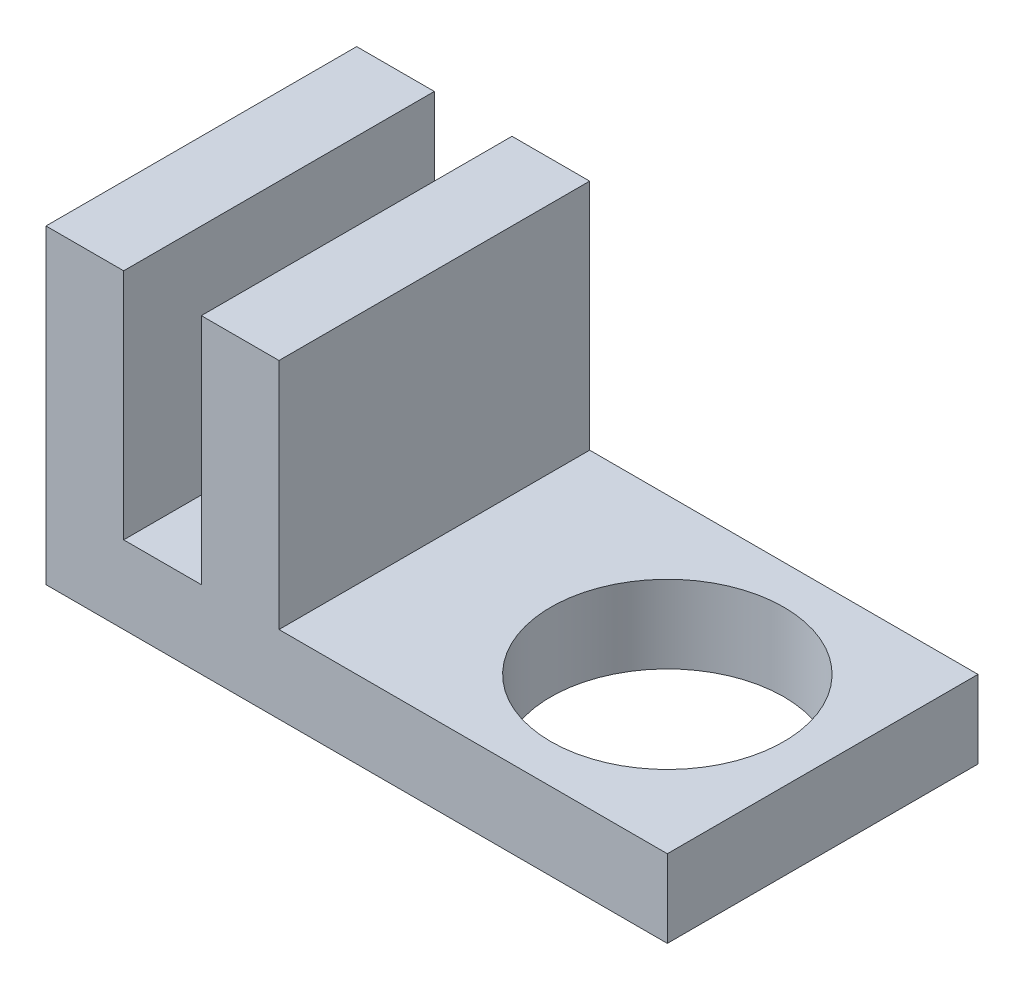
ISO-10303-21;
HEADER;
FILE_DESCRIPTION(('STEP AP214'),'2;1');
FILE_NAME('part.step','',(''),(''),'','','');
FILE_SCHEMA(('AUTOMOTIVE_DESIGN { 1 0 10303 214 1 1 1 1 }'));
ENDSEC;
DATA;
#1=APPLICATION_CONTEXT('core data for automotive mechanical design processes');
#2=APPLICATION_PROTOCOL_DEFINITION('international standard','automotive_design',2000,#1);
#3=PRODUCT_CONTEXT('',#1,'mechanical');
#4=PRODUCT('Part','Part','',(#3));
#5=PRODUCT_RELATED_PRODUCT_CATEGORY('part','',(#4));
#6=PRODUCT_DEFINITION_FORMATION('','',#4);
#7=PRODUCT_DEFINITION_CONTEXT('part definition',#1,'design');
#8=PRODUCT_DEFINITION('design','',#6,#7);
#9=PRODUCT_DEFINITION_SHAPE('','',#8);
#10=(LENGTH_UNIT() NAMED_UNIT(*) SI_UNIT(.MILLI.,.METRE.));
#11=(NAMED_UNIT(*) PLANE_ANGLE_UNIT() SI_UNIT($,.RADIAN.));
#12=(NAMED_UNIT(*) SI_UNIT($,.STERADIAN.) SOLID_ANGLE_UNIT());
#13=UNCERTAINTY_MEASURE_WITH_UNIT(LENGTH_MEASURE(1.E-05),#10,'distance_accuracy_value','');
#14=(GEOMETRIC_REPRESENTATION_CONTEXT(3) GLOBAL_UNCERTAINTY_ASSIGNED_CONTEXT((#13)) GLOBAL_UNIT_ASSIGNED_CONTEXT((#10,
#11,#12)) REPRESENTATION_CONTEXT('',''));
#15=CARTESIAN_POINT('',(0.,0.,0.));
#16=DIRECTION('',(0.,0.,1.));
#17=DIRECTION('',(1.,0.,0.));
#18=AXIS2_PLACEMENT_3D('',#15,#16,#17);
#19=CARTESIAN_POINT('',(0.,40.,0.));
#20=DIRECTION('',(0.,0.,-1.));
#21=DIRECTION('',(-1.,0.,0.));
#22=AXIS2_PLACEMENT_3D('',#19,#20,#21);
#23=PLANE('',#22);
#24=DIRECTION('',(1.,0.,0.));
#25=VECTOR('',#24,1.);
#26=CARTESIAN_POINT('',(0.,0.,0.));
#27=LINE('',#26,#25);
#28=CARTESIAN_POINT('',(0.,0.,0.));
#29=VERTEX_POINT('',#28);
#30=CARTESIAN_POINT('',(80.,0.,0.));
#31=VERTEX_POINT('',#30);
#32=EDGE_CURVE('E242',#29,#31,#27,.T.);
#33=ORIENTED_EDGE('',*,*,#32,.T.);
#34=DIRECTION('',(0.,-1.,0.));
#35=VECTOR('',#34,1.);
#36=CARTESIAN_POINT('',(80.,10.,0.));
#37=LINE('',#36,#35);
#38=CARTESIAN_POINT('',(80.,10.,0.));
#39=VERTEX_POINT('',#38);
#40=EDGE_CURVE('E122',#39,#31,#37,.T.);
#41=ORIENTED_EDGE('',*,*,#40,.F.);
#42=DIRECTION('',(1.,0.,0.));
#43=VECTOR('',#42,1.);
#44=CARTESIAN_POINT('',(0.,10.,0.));
#45=LINE('',#44,#43);
#46=CARTESIAN_POINT('',(30.,10.,0.));
#47=VERTEX_POINT('',#46);
#48=EDGE_CURVE('E117',#47,#39,#45,.T.);
#49=ORIENTED_EDGE('',*,*,#48,.F.);
#50=DIRECTION('',(0.,-1.,0.));
#51=VECTOR('',#50,1.);
#52=CARTESIAN_POINT('',(30.,40.,0.));
#53=LINE('',#52,#51);
#54=CARTESIAN_POINT('',(30.,40.,0.));
#55=VERTEX_POINT('',#54);
#56=EDGE_CURVE('E120',#55,#47,#53,.T.);
#57=ORIENTED_EDGE('',*,*,#56,.F.);
#58=DIRECTION('',(1.,0.,0.));
#59=VECTOR('',#58,1.);
#60=CARTESIAN_POINT('',(0.,40.,0.));
#61=LINE('',#60,#59);
#62=CARTESIAN_POINT('',(20.,40.,0.));
#63=VERTEX_POINT('',#62);
#64=EDGE_CURVE('E166',#63,#55,#61,.T.);
#65=ORIENTED_EDGE('',*,*,#64,.F.);
#66=DIRECTION('',(0.,-1.,0.));
#67=VECTOR('',#66,1.);
#68=CARTESIAN_POINT('',(20.,40.,0.));
#69=LINE('',#68,#67);
#70=CARTESIAN_POINT('',(20.,9.99999999999999,0.));
#71=VERTEX_POINT('',#70);
#72=EDGE_CURVE('E151',#63,#71,#69,.T.);
#73=ORIENTED_EDGE('',*,*,#72,.T.);
#74=DIRECTION('',(1.,0.,0.));
#75=VECTOR('',#74,1.);
#76=CARTESIAN_POINT('',(0.,10.,0.));
#77=LINE('',#76,#75);
#78=CARTESIAN_POINT('',(10.,10.,0.));
#79=VERTEX_POINT('',#78);
#80=EDGE_CURVE('E134',#79,#71,#77,.T.);
#81=ORIENTED_EDGE('',*,*,#80,.F.);
#82=DIRECTION('',(0.,-1.,0.));
#83=VECTOR('',#82,1.);
#84=CARTESIAN_POINT('',(10.,40.,0.));
#85=LINE('',#84,#83);
#86=CARTESIAN_POINT('',(10.,40.,0.));
#87=VERTEX_POINT('',#86);
#88=EDGE_CURVE('E11',#87,#79,#85,.T.);
#89=ORIENTED_EDGE('',*,*,#88,.F.);
#90=DIRECTION('',(1.,0.,0.));
#91=VECTOR('',#90,1.);
#92=CARTESIAN_POINT('',(0.,40.,0.));
#93=LINE('',#92,#91);
#94=CARTESIAN_POINT('',(0.,40.,0.));
#95=VERTEX_POINT('',#94);
#96=EDGE_CURVE('E258',#95,#87,#93,.T.);
#97=ORIENTED_EDGE('',*,*,#96,.F.);
#98=DIRECTION('',(0.,-1.,0.));
#99=VECTOR('',#98,1.);
#100=CARTESIAN_POINT('',(0.,40.,0.));
#101=LINE('',#100,#99);
#102=EDGE_CURVE('E260',#95,#29,#101,.T.);
#103=ORIENTED_EDGE('',*,*,#102,.T.);
#104=EDGE_LOOP('',(#33,#41,#49,#57,#65,#73,#81,#89,#97,#103));
#105=FACE_BOUND('',#104,.T.);
#106=ADVANCED_FACE('F35',(#105),#23,.F.);
#107=CARTESIAN_POINT('',(10.,40.,0.));
#108=DIRECTION('',(-1.,0.,0.));
#109=DIRECTION('',(0.,0.,1.));
#110=AXIS2_PLACEMENT_3D('',#107,#108,#109);
#111=PLANE('',#110);
#112=ORIENTED_EDGE('',*,*,#88,.T.);
#113=DIRECTION('',(0.,0.,-1.));
#114=VECTOR('',#113,1.);
#115=CARTESIAN_POINT('',(10.,10.,0.));
#116=LINE('',#115,#114);
#117=CARTESIAN_POINT('',(10.,9.99999999999999,-40.));
#118=VERTEX_POINT('',#117);
#119=EDGE_CURVE('E251',#79,#118,#116,.T.);
#120=ORIENTED_EDGE('',*,*,#119,.T.);
#121=DIRECTION('',(0.,-1.,0.));
#122=VECTOR('',#121,1.);
#123=CARTESIAN_POINT('',(10.,40.,-40.));
#124=LINE('',#123,#122);
#125=CARTESIAN_POINT('',(10.,40.,-40.));
#126=VERTEX_POINT('',#125);
#127=EDGE_CURVE('E43',#126,#118,#124,.T.);
#128=ORIENTED_EDGE('',*,*,#127,.F.);
#129=DIRECTION('',(0.,0.,-1.));
#130=VECTOR('',#129,1.);
#131=CARTESIAN_POINT('',(10.,40.,0.));
#132=LINE('',#131,#130);
#133=EDGE_CURVE('E255',#87,#126,#132,.T.);
#134=ORIENTED_EDGE('',*,*,#133,.F.);
#135=EDGE_LOOP('',(#112,#120,#128,#134));
#136=FACE_BOUND('',#135,.T.);
#137=ADVANCED_FACE('F197',(#136),#111,.F.);
#138=CARTESIAN_POINT('',(0.,40.,-40.));
#139=DIRECTION('',(0.,0.,-1.));
#140=DIRECTION('',(-1.,0.,0.));
#141=AXIS2_PLACEMENT_3D('',#138,#139,#140);
#142=PLANE('',#141);
#143=DIRECTION('',(1.,0.,0.));
#144=VECTOR('',#143,1.);
#145=CARTESIAN_POINT('',(0.,0.,-40.));
#146=LINE('',#145,#144);
#147=CARTESIAN_POINT('',(0.,0.,-40.));
#148=VERTEX_POINT('',#147);
#149=CARTESIAN_POINT('',(80.,0.,-40.));
#150=VERTEX_POINT('',#149);
#151=EDGE_CURVE('E245',#148,#150,#146,.T.);
#152=ORIENTED_EDGE('',*,*,#151,.F.);
#153=DIRECTION('',(0.,-1.,0.));
#154=VECTOR('',#153,1.);
#155=CARTESIAN_POINT('',(0.,40.,-40.));
#156=LINE('',#155,#154);
#157=CARTESIAN_POINT('',(0.,40.,-40.));
#158=VERTEX_POINT('',#157);
#159=EDGE_CURVE('E268',#158,#148,#156,.T.);
#160=ORIENTED_EDGE('',*,*,#159,.F.);
#161=DIRECTION('',(1.,0.,0.));
#162=VECTOR('',#161,1.);
#163=CARTESIAN_POINT('',(0.,40.,-40.));
#164=LINE('',#163,#162);
#165=EDGE_CURVE('E266',#158,#126,#164,.T.);
#166=ORIENTED_EDGE('',*,*,#165,.T.);
#167=ORIENTED_EDGE('',*,*,#127,.T.);
#168=DIRECTION('',(1.,0.,0.));
#169=VECTOR('',#168,1.);
#170=CARTESIAN_POINT('',(0.,10.,-40.));
#171=LINE('',#170,#169);
#172=CARTESIAN_POINT('',(20.,10.,-40.));
#173=VERTEX_POINT('',#172);
#174=EDGE_CURVE('E59',#118,#173,#171,.T.);
#175=ORIENTED_EDGE('',*,*,#174,.T.);
#176=DIRECTION('',(0.,-1.,0.));
#177=VECTOR('',#176,1.);
#178=CARTESIAN_POINT('',(20.,40.,-40.));
#179=LINE('',#178,#177);
#180=CARTESIAN_POINT('',(20.,40.,-40.));
#181=VERTEX_POINT('',#180);
#182=EDGE_CURVE('E140',#181,#173,#179,.T.);
#183=ORIENTED_EDGE('',*,*,#182,.F.);
#184=DIRECTION('',(1.,0.,0.));
#185=VECTOR('',#184,1.);
#186=CARTESIAN_POINT('',(0.,40.,-40.));
#187=LINE('',#186,#185);
#188=CARTESIAN_POINT('',(30.,40.,-40.));
#189=VERTEX_POINT('',#188);
#190=EDGE_CURVE('E162',#181,#189,#187,.T.);
#191=ORIENTED_EDGE('',*,*,#190,.T.);
#192=DIRECTION('',(0.,-1.,0.));
#193=VECTOR('',#192,1.);
#194=CARTESIAN_POINT('',(30.,40.,-40.));
#195=LINE('',#194,#193);
#196=CARTESIAN_POINT('',(30.,9.99999999999999,-40.));
#197=VERTEX_POINT('',#196);
#198=EDGE_CURVE('E135',#189,#197,#195,.T.);
#199=ORIENTED_EDGE('',*,*,#198,.T.);
#200=DIRECTION('',(1.,0.,0.));
#201=VECTOR('',#200,1.);
#202=CARTESIAN_POINT('',(0.,10.,-40.));
#203=LINE('',#202,#201);
#204=CARTESIAN_POINT('',(80.,10.,-40.));
#205=VERTEX_POINT('',#204);
#206=EDGE_CURVE('E51',#197,#205,#203,.T.);
#207=ORIENTED_EDGE('',*,*,#206,.T.);
#208=DIRECTION('',(0.,-1.,0.));
#209=VECTOR('',#208,1.);
#210=CARTESIAN_POINT('',(80.,10.,-40.));
#211=LINE('',#210,#209);
#212=EDGE_CURVE('E169',#205,#150,#211,.T.);
#213=ORIENTED_EDGE('',*,*,#212,.T.);
#214=EDGE_LOOP('',(#152,#160,#166,#167,#175,#183,#191,#199,#207,#213));
#215=FACE_BOUND('',#214,.T.);
#216=ADVANCED_FACE('F201',(#215),#142,.T.);
#217=CARTESIAN_POINT('',(0.,40.,0.));
#218=DIRECTION('',(-1.,0.,0.));
#219=DIRECTION('',(0.,0.,1.));
#220=AXIS2_PLACEMENT_3D('',#217,#218,#219);
#221=PLANE('',#220);
#222=DIRECTION('',(0.,0.,-1.));
#223=VECTOR('',#222,1.);
#224=CARTESIAN_POINT('',(0.,0.,0.));
#225=LINE('',#224,#223);
#226=EDGE_CURVE('E246',#29,#148,#225,.T.);
#227=ORIENTED_EDGE('',*,*,#226,.F.);
#228=ORIENTED_EDGE('',*,*,#102,.F.);
#229=DIRECTION('',(0.,0.,-1.));
#230=VECTOR('',#229,1.);
#231=CARTESIAN_POINT('',(0.,40.,0.));
#232=LINE('',#231,#230);
#233=EDGE_CURVE('E264',#95,#158,#232,.T.);
#234=ORIENTED_EDGE('',*,*,#233,.T.);
#235=ORIENTED_EDGE('',*,*,#159,.T.);
#236=EDGE_LOOP('',(#227,#228,#234,#235));
#237=FACE_BOUND('',#236,.T.);
#238=ADVANCED_FACE('F206',(#237),#221,.T.);
#239=CARTESIAN_POINT('',(0.,40.,0.));
#240=DIRECTION('',(0.,1.,0.));
#241=DIRECTION('',(0.,0.,1.));
#242=AXIS2_PLACEMENT_3D('',#239,#240,#241);
#243=PLANE('',#242);
#244=ORIENTED_EDGE('',*,*,#96,.T.);
#245=ORIENTED_EDGE('',*,*,#133,.T.);
#246=ORIENTED_EDGE('',*,*,#165,.F.);
#247=ORIENTED_EDGE('',*,*,#233,.F.);
#248=EDGE_LOOP('',(#244,#245,#246,#247));
#249=FACE_BOUND('',#248,.T.);
#250=ADVANCED_FACE('F212',(#249),#243,.T.);
#251=CARTESIAN_POINT('',(0.,0.,0.));
#252=DIRECTION('',(0.,1.,0.));
#253=DIRECTION('',(0.,0.,1.));
#254=AXIS2_PLACEMENT_3D('',#251,#252,#253);
#255=PLANE('',#254);
#256=ORIENTED_EDGE('',*,*,#32,.F.);
#257=ORIENTED_EDGE('',*,*,#226,.T.);
#258=ORIENTED_EDGE('',*,*,#151,.T.);
#259=DIRECTION('',(0.,0.,-1.));
#260=VECTOR('',#259,1.);
#261=CARTESIAN_POINT('',(80.,0.,0.));
#262=LINE('',#261,#260);
#263=EDGE_CURVE('E172',#31,#150,#262,.T.);
#264=ORIENTED_EDGE('',*,*,#263,.F.);
#265=EDGE_LOOP('',(#256,#257,#258,#264));
#266=FACE_BOUND('',#265,.T.);
#267=CARTESIAN_POINT('',(60.,0.,-20.));
#268=DIRECTION('',(0.,1.,0.));
#269=DIRECTION('',(0.,0.,1.));
#270=AXIS2_PLACEMENT_3D('',#267,#268,#269);
#271=CIRCLE('',#270,15.);
#272=CARTESIAN_POINT('',(60.,0.,-5.));
#273=VERTEX_POINT('',#272);
#274=EDGE_CURVE('E175',#273,#273,#271,.T.);
#275=ORIENTED_EDGE('',*,*,#274,.T.);
#276=EDGE_LOOP('',(#275));
#277=FACE_BOUND('',#276,.T.);
#278=ADVANCED_FACE('F214',(#266,#277),#255,.F.);
#279=CARTESIAN_POINT('',(0.,10.,0.));
#280=DIRECTION('',(0.,1.,0.));
#281=DIRECTION('',(0.,0.,1.));
#282=AXIS2_PLACEMENT_3D('',#279,#280,#281);
#283=PLANE('',#282);
#284=ORIENTED_EDGE('',*,*,#80,.T.);
#285=DIRECTION('',(0.,0.,-1.));
#286=VECTOR('',#285,1.);
#287=CARTESIAN_POINT('',(20.,10.,0.));
#288=LINE('',#287,#286);
#289=EDGE_CURVE('E138',#71,#173,#288,.T.);
#290=ORIENTED_EDGE('',*,*,#289,.T.);
#291=ORIENTED_EDGE('',*,*,#174,.F.);
#292=ORIENTED_EDGE('',*,*,#119,.F.);
#293=EDGE_LOOP('',(#284,#290,#291,#292));
#294=FACE_BOUND('',#293,.T.);
#295=ADVANCED_FACE('F217',(#294),#283,.T.);
#296=CARTESIAN_POINT('',(20.,40.,0.));
#297=DIRECTION('',(-1.,0.,0.));
#298=DIRECTION('',(0.,0.,1.));
#299=AXIS2_PLACEMENT_3D('',#296,#297,#298);
#300=PLANE('',#299);
#301=ORIENTED_EDGE('',*,*,#289,.F.);
#302=ORIENTED_EDGE('',*,*,#72,.F.);
#303=DIRECTION('',(0.,0.,-1.));
#304=VECTOR('',#303,1.);
#305=CARTESIAN_POINT('',(20.,40.,0.));
#306=LINE('',#305,#304);
#307=EDGE_CURVE('E155',#63,#181,#306,.T.);
#308=ORIENTED_EDGE('',*,*,#307,.T.);
#309=ORIENTED_EDGE('',*,*,#182,.T.);
#310=EDGE_LOOP('',(#301,#302,#308,#309));
#311=FACE_BOUND('',#310,.T.);
#312=ADVANCED_FACE('F224',(#311),#300,.T.);
#313=CARTESIAN_POINT('',(30.,40.,0.));
#314=DIRECTION('',(-1.,0.,0.));
#315=DIRECTION('',(0.,0.,1.));
#316=AXIS2_PLACEMENT_3D('',#313,#314,#315);
#317=PLANE('',#316);
#318=ORIENTED_EDGE('',*,*,#56,.T.);
#319=DIRECTION('',(0.,0.,-1.));
#320=VECTOR('',#319,1.);
#321=CARTESIAN_POINT('',(30.,10.,0.));
#322=LINE('',#321,#320);
#323=EDGE_CURVE('E124',#47,#197,#322,.T.);
#324=ORIENTED_EDGE('',*,*,#323,.T.);
#325=ORIENTED_EDGE('',*,*,#198,.F.);
#326=DIRECTION('',(0.,0.,-1.));
#327=VECTOR('',#326,1.);
#328=CARTESIAN_POINT('',(30.,40.,0.));
#329=LINE('',#328,#327);
#330=EDGE_CURVE('E132',#55,#189,#329,.T.);
#331=ORIENTED_EDGE('',*,*,#330,.F.);
#332=EDGE_LOOP('',(#318,#324,#325,#331));
#333=FACE_BOUND('',#332,.T.);
#334=ADVANCED_FACE('F131',(#333),#317,.F.);
#335=CARTESIAN_POINT('',(0.,40.,0.));
#336=DIRECTION('',(0.,1.,0.));
#337=DIRECTION('',(0.,0.,1.));
#338=AXIS2_PLACEMENT_3D('',#335,#336,#337);
#339=PLANE('',#338);
#340=ORIENTED_EDGE('',*,*,#64,.T.);
#341=ORIENTED_EDGE('',*,*,#330,.T.);
#342=ORIENTED_EDGE('',*,*,#190,.F.);
#343=ORIENTED_EDGE('',*,*,#307,.F.);
#344=EDGE_LOOP('',(#340,#341,#342,#343));
#345=FACE_BOUND('',#344,.T.);
#346=ADVANCED_FACE('F227',(#345),#339,.T.);
#347=CARTESIAN_POINT('',(80.,10.,0.));
#348=DIRECTION('',(-1.,0.,0.));
#349=DIRECTION('',(0.,0.,1.));
#350=AXIS2_PLACEMENT_3D('',#347,#348,#349);
#351=PLANE('',#350);
#352=ORIENTED_EDGE('',*,*,#263,.T.);
#353=ORIENTED_EDGE('',*,*,#212,.F.);
#354=DIRECTION('',(0.,0.,-1.));
#355=VECTOR('',#354,1.);
#356=CARTESIAN_POINT('',(80.,10.,0.));
#357=LINE('',#356,#355);
#358=EDGE_CURVE('E123',#39,#205,#357,.T.);
#359=ORIENTED_EDGE('',*,*,#358,.F.);
#360=ORIENTED_EDGE('',*,*,#40,.T.);
#361=EDGE_LOOP('',(#352,#353,#359,#360));
#362=FACE_BOUND('',#361,.T.);
#363=ADVANCED_FACE('F193',(#362),#351,.F.);
#364=CARTESIAN_POINT('',(60.,10.,-20.));
#365=DIRECTION('',(0.,-1.,0.));
#366=DIRECTION('',(0.,0.,-1.));
#367=AXIS2_PLACEMENT_3D('',#364,#365,#366);
#368=CYLINDRICAL_SURFACE('',#367,15.);
#369=CARTESIAN_POINT('',(60.,10.,-20.));
#370=DIRECTION('',(0.,1.,0.));
#371=DIRECTION('',(0.,0.,1.));
#372=AXIS2_PLACEMENT_3D('',#369,#370,#371);
#373=CIRCLE('',#372,15.);
#374=CARTESIAN_POINT('',(60.,10.,-5.));
#375=VERTEX_POINT('',#374);
#376=EDGE_CURVE('E129',#375,#375,#373,.T.);
#377=ORIENTED_EDGE('',*,*,#376,.T.);
#378=EDGE_LOOP('',(#377));
#379=FACE_BOUND('',#378,.T.);
#380=ORIENTED_EDGE('',*,*,#274,.F.);
#381=EDGE_LOOP('',(#380));
#382=FACE_BOUND('',#381,.T.);
#383=ADVANCED_FACE('F185',(#379,#382),#368,.F.);
#384=CARTESIAN_POINT('',(0.,10.,0.));
#385=DIRECTION('',(0.,1.,0.));
#386=DIRECTION('',(0.,0.,1.));
#387=AXIS2_PLACEMENT_3D('',#384,#385,#386);
#388=PLANE('',#387);
#389=ORIENTED_EDGE('',*,*,#376,.F.);
#390=EDGE_LOOP('',(#389));
#391=FACE_BOUND('',#390,.T.);
#392=ORIENTED_EDGE('',*,*,#323,.F.);
#393=ORIENTED_EDGE('',*,*,#48,.T.);
#394=ORIENTED_EDGE('',*,*,#358,.T.);
#395=ORIENTED_EDGE('',*,*,#206,.F.);
#396=EDGE_LOOP('',(#392,#393,#394,#395));
#397=FACE_BOUND('',#396,.T.);
#398=ADVANCED_FACE('F125',(#391,#397),#388,.T.);
#399=CLOSED_SHELL('',(#106,#137,#216,#238,#250,#278,#295,#312,#334,#346,#363,#383,#398));
#400=MANIFOLD_SOLID_BREP('B2',#399);
#401=ADVANCED_BREP_SHAPE_REPRESENTATION('',(#18,#400),#14);
#402=SHAPE_DEFINITION_REPRESENTATION(#9,#401);
ENDSEC;
END-ISO-10303-21;
